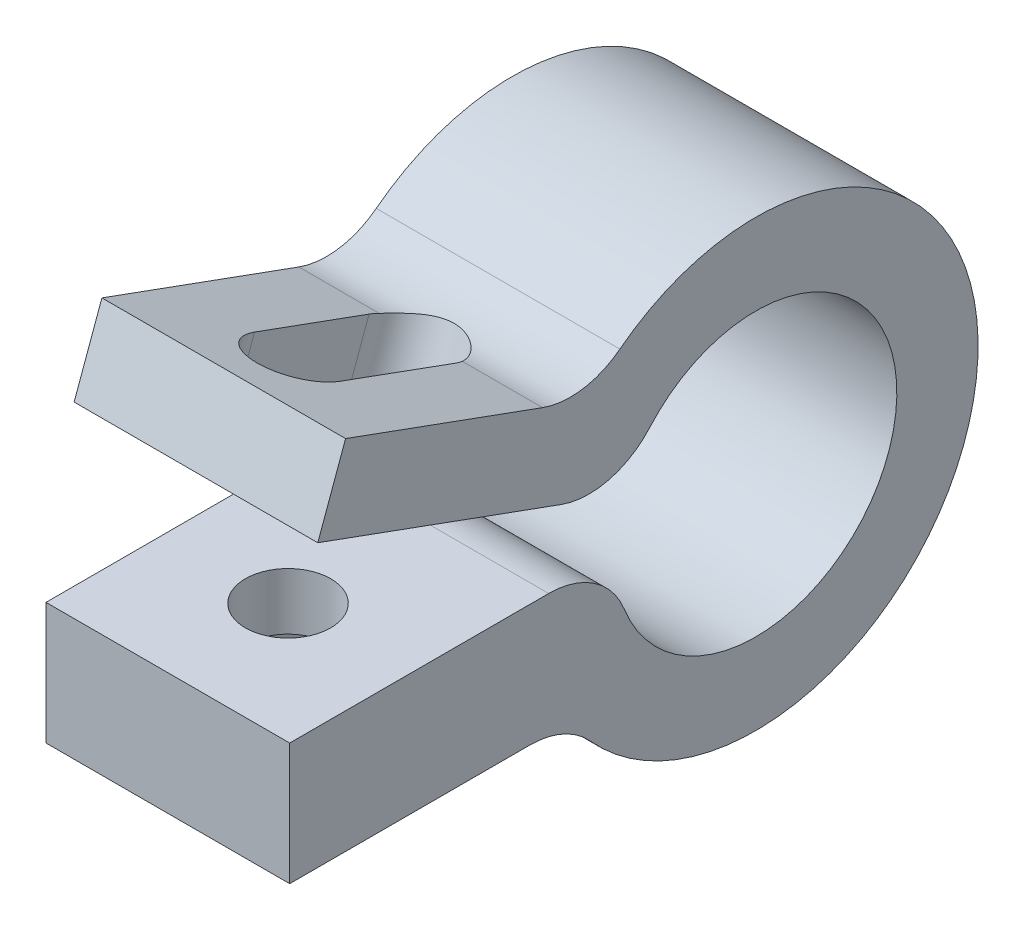
ISO-10303-21;
HEADER;
FILE_DESCRIPTION(('STEP AP214'),'2;1');
FILE_NAME('part.step','',(''),(''),'','','');
FILE_SCHEMA(('AUTOMOTIVE_DESIGN { 1 0 10303 214 1 1 1 1 }'));
ENDSEC;
DATA;
#1=APPLICATION_CONTEXT('core data for automotive mechanical design processes');
#2=APPLICATION_PROTOCOL_DEFINITION('international standard','automotive_design',2000,#1);
#3=PRODUCT_CONTEXT('',#1,'mechanical');
#4=PRODUCT('Part','Part','',(#3));
#5=PRODUCT_RELATED_PRODUCT_CATEGORY('part','',(#4));
#6=PRODUCT_DEFINITION_FORMATION('','',#4);
#7=PRODUCT_DEFINITION_CONTEXT('part definition',#1,'design');
#8=PRODUCT_DEFINITION('design','',#6,#7);
#9=PRODUCT_DEFINITION_SHAPE('','',#8);
#10=(LENGTH_UNIT() NAMED_UNIT(*) SI_UNIT(.MILLI.,.METRE.));
#11=(NAMED_UNIT(*) PLANE_ANGLE_UNIT() SI_UNIT($,.RADIAN.));
#12=(NAMED_UNIT(*) SI_UNIT($,.STERADIAN.) SOLID_ANGLE_UNIT());
#13=UNCERTAINTY_MEASURE_WITH_UNIT(LENGTH_MEASURE(1.E-05),#10,'distance_accuracy_value','');
#14=(GEOMETRIC_REPRESENTATION_CONTEXT(3) GLOBAL_UNCERTAINTY_ASSIGNED_CONTEXT((#13)) GLOBAL_UNIT_ASSIGNED_CONTEXT((#10,
#11,#12)) REPRESENTATION_CONTEXT('',''));
#15=CARTESIAN_POINT('',(0.,0.,0.));
#16=DIRECTION('',(0.,0.,1.));
#17=DIRECTION('',(1.,0.,0.));
#18=AXIS2_PLACEMENT_3D('',#15,#16,#17);
#19=CARTESIAN_POINT('',(6.,5.91853019811814,4.56581047503765));
#20=DIRECTION('',(-1.,0.,0.));
#21=DIRECTION('',(0.,0.,1.));
#22=AXIS2_PLACEMENT_3D('',#19,#20,#21);
#23=CYLINDRICAL_SURFACE('',#22,2.);
#24=CARTESIAN_POINT('',(4.02328075568502,4.03914495654632,5.24985076168898));
#25=CARTESIAN_POINT('',(4.01693659567688,4.02970640876131,5.22392671768483));
#26=CARTESIAN_POINT('',(4.00947704172476,4.02090379476189,5.19806314313565));
#27=CARTESIAN_POINT('',(3.99239936936169,4.00454872920655,5.14667174657911));
#28=CARTESIAN_POINT('',(3.98278243428403,3.99699559623572,5.12114374860172));
#29=CARTESIAN_POINT('',(3.95090081664605,3.97623467445256,5.04560145776037));
#30=CARTESIAN_POINT('',(3.92553880432151,3.96482924824209,4.99635912912839));
#31=CARTESIAN_POINT('',(3.8674641482402,3.94635006833639,4.90171972922054));
#32=CARTESIAN_POINT('',(3.83476389760315,3.93926908551365,4.85631635051501));
#33=CARTESIAN_POINT('',(3.76282939996074,3.9285595645157,4.77048068709393));
#34=CARTESIAN_POINT('',(3.72358729925232,3.92493521171681,4.73005448029087));
#35=CARTESIAN_POINT('',(3.63691402422221,3.92004334134182,4.65313738749375));
#36=CARTESIAN_POINT('',(3.58913121670079,3.91893154042587,4.61703212303424));
#37=CARTESIAN_POINT('',(3.48828882360345,3.91831438457499,4.55311418065907));
#38=CARTESIAN_POINT('',(3.43522959343984,3.91880892151038,4.52530094470803));
#39=CARTESIAN_POINT('',(3.32439795432762,3.92027956767505,4.47895899681839));
#40=CARTESIAN_POINT('',(3.26657536131501,3.9212615584193,4.46054939327361));
#41=CARTESIAN_POINT('',(3.14853981230169,3.92279061232673,4.43467083473479));
#42=CARTESIAN_POINT('',(3.08832878843552,3.92333801980751,4.42719321443808));
#43=CARTESIAN_POINT('',(2.97239510333669,3.92357725864138,4.4238167764806));
#44=CARTESIAN_POINT('',(2.91669655774002,3.92333370769233,4.42704390482159));
#45=CARTESIAN_POINT('',(2.80668177482694,3.92228995073745,4.44298047083795));
#46=CARTESIAN_POINT('',(2.75236570335653,3.92148967826875,4.45569104068445));
#47=CARTESIAN_POINT('',(2.64749279538036,3.91991298592941,4.4895981827193));
#48=CARTESIAN_POINT('',(2.59688795598907,3.91913639149086,4.51064778058917));
#49=CARTESIAN_POINT('',(2.49953091048112,3.91838414100569,4.56030293243714));
#50=CARTESIAN_POINT('',(2.45277984391418,3.91840872101843,4.58891071090721));
#51=CARTESIAN_POINT('',(2.3605118918484,3.92023325937804,4.65521019332456));
#52=CARTESIAN_POINT('',(2.31538453571052,3.92217337173441,4.69344112153393));
#53=CARTESIAN_POINT('',(2.23163805036825,3.92920209177196,4.77628575772425));
#54=CARTESIAN_POINT('',(2.19302385397557,3.93429307229314,4.82090425654101));
#55=CARTESIAN_POINT('',(2.12222450093141,3.94892622196349,4.91663994059504));
#56=CARTESIAN_POINT('',(2.090287509493,3.95860695541151,4.96792057306711));
#57=CARTESIAN_POINT('',(2.03568354662144,3.98338210061301,5.07387586249259));
#58=CARTESIAN_POINT('',(2.01298965015112,3.9984605442611,5.12854011923511));
#59=CARTESIAN_POINT('',(1.98832564335841,4.02352983834558,5.20575072036161));
#60=CARTESIAN_POINT('',(1.98211042650697,4.03110657602283,5.22778962504117));
#61=CARTESIAN_POINT('',(1.97671924431497,4.03914495654632,5.24985076168898));
#62=B_SPLINE_CURVE_WITH_KNOTS('',3,(#24,#25,#26,#27,#28,#29,#30,#31,#32,#33,#34,#35,#36,#37,#38,
#39,#40,#41,#42,#43,#44,#45,#46,#47,#48,#49,#50,#51,#52,#53,#54,#55,#56,#57,#58,#59,#60,#61),
.UNSPECIFIED.,.F.,.F.,(4,2,2,2,2,2,2,2,2,2,2,2,2,2,2,2,2,2,4),(0.,0.0848652684053053,
0.169684101151295,0.338452108342028,0.50693720996127,0.675626059629812,0.854512262027348,
1.03338642305597,1.21447331012985,1.39541657961535,1.56196093275596,1.72852517180851,
1.89227577154278,2.05607461945785,2.23281843301014,2.40969551013387,2.59229010533237,
2.77434893334036,2.84663638555457),.UNSPECIFIED.);
#63=CARTESIAN_POINT('',(4.02328075568502,4.03914495654632,5.24985076168898));
#64=VERTEX_POINT('',#63);
#65=CARTESIAN_POINT('',(1.97671924431497,4.03914495654632,5.24985076168898));
#66=VERTEX_POINT('',#65);
#67=EDGE_CURVE('E281',#64,#66,#62,.T.);
#68=ORIENTED_EDGE('',*,*,#67,.F.);
#69=DIRECTION('',(-1.,0.,0.));
#70=VECTOR('',#69,1.);
#71=CARTESIAN_POINT('',(6.,4.03914495654632,5.24985076168898));
#72=LINE('',#71,#70);
#73=CARTESIAN_POINT('',(6.,4.03914495654632,5.24985076168898));
#74=VERTEX_POINT('',#73);
#75=EDGE_CURVE('E348',#74,#64,#72,.T.);
#76=ORIENTED_EDGE('',*,*,#75,.F.);
#77=CARTESIAN_POINT('',(6.,5.91853019811814,4.56581047503765));
#78=DIRECTION('',(-1.,0.,0.));
#79=DIRECTION('',(0.,0.,1.));
#80=AXIS2_PLACEMENT_3D('',#77,#78,#79);
#81=CIRCLE('',#80,2.);
#82=CARTESIAN_POINT('',(6.,4.33497696785242,3.344188943255));
#83=VERTEX_POINT('',#82);
#84=EDGE_CURVE('E430',#83,#74,#81,.T.);
#85=ORIENTED_EDGE('',*,*,#84,.F.);
#86=DIRECTION('',(-1.,0.,0.));
#87=VECTOR('',#86,1.);
#88=CARTESIAN_POINT('',(6.,4.33497696785242,3.344188943255));
#89=LINE('',#88,#87);
#90=CARTESIAN_POINT('',(0.,4.33497696785242,3.344188943255));
#91=VERTEX_POINT('',#90);
#92=EDGE_CURVE('E406',#83,#91,#89,.T.);
#93=ORIENTED_EDGE('',*,*,#92,.T.);
#94=CARTESIAN_POINT('',(0.,5.91853019811814,4.56581047503765));
#95=DIRECTION('',(-1.,0.,0.));
#96=DIRECTION('',(0.,0.,1.));
#97=AXIS2_PLACEMENT_3D('',#94,#95,#96);
#98=CIRCLE('',#97,2.);
#99=CARTESIAN_POINT('',(0.,4.03914495654632,5.24985076168898));
#100=VERTEX_POINT('',#99);
#101=EDGE_CURVE('E366',#91,#100,#98,.T.);
#102=ORIENTED_EDGE('',*,*,#101,.T.);
#103=EDGE_CURVE('E404',#66,#100,#72,.T.);
#104=ORIENTED_EDGE('',*,*,#103,.F.);
#105=EDGE_LOOP('',(#68,#76,#85,#93,#102,#104));
#106=FACE_BOUND('',#105,.T.);
#107=ADVANCED_FACE('F41',(#106),#23,.F.);
#108=CARTESIAN_POINT('',(6.,4.03914495654632,5.24985076168898));
#109=DIRECTION('',(0.,-0.939692620785909,0.342020143325667));
#110=DIRECTION('',(0.,-0.342020143325667,-0.939692620785909));
#111=AXIS2_PLACEMENT_3D('',#108,#109,#110);
#112=PLANE('',#111);
#113=CARTESIAN_POINT('',(3.,4.11964439085314,5.47102113972583));
#114=DIRECTION('',(0.,-0.939692620785909,0.342020143325667));
#115=DIRECTION('',(0.,-0.342020143325667,-0.939692620785909));
#116=AXIS2_PLACEMENT_3D('',#113,#114,#115);
#117=CIRCLE('',#116,1.05);
#118=CARTESIAN_POINT('',(4.05,4.11964439085314,5.47102113972583));
#119=VERTEX_POINT('',#118);
#120=EDGE_CURVE('E282',#119,#64,#117,.F.);
#121=ORIENTED_EDGE('',*,*,#120,.F.);
#122=DIRECTION('',(0.,-0.342020143325667,-0.939692620785909));
#123=VECTOR('',#122,1.);
#124=CARTESIAN_POINT('',(4.05,4.03914495654632,5.24985076168898));
#125=LINE('',#124,#123);
#126=CARTESIAN_POINT('',(4.05,5.14570482083014,8.29009900208356));
#127=VERTEX_POINT('',#126);
#128=EDGE_CURVE('E273',#127,#119,#125,.T.);
#129=ORIENTED_EDGE('',*,*,#128,.F.);
#130=CARTESIAN_POINT('',(3.,5.14570482083014,8.29009900208356));
#131=DIRECTION('',(0.,-0.939692620785909,0.342020143325667));
#132=DIRECTION('',(0.,-0.342020143325667,-0.939692620785909));
#133=AXIS2_PLACEMENT_3D('',#130,#131,#132);
#134=CIRCLE('',#133,1.05);
#135=CARTESIAN_POINT('',(1.95,5.14570482083014,8.29009900208356));
#136=VERTEX_POINT('',#135);
#137=EDGE_CURVE('E275',#136,#127,#134,.F.);
#138=ORIENTED_EDGE('',*,*,#137,.F.);
#139=DIRECTION('',(0.,0.342020143325667,0.939692620785909));
#140=VECTOR('',#139,1.);
#141=CARTESIAN_POINT('',(1.95,4.03914495654632,5.24985076168898));
#142=LINE('',#141,#140);
#143=CARTESIAN_POINT('',(1.95,4.11964439085314,5.47102113972583));
#144=VERTEX_POINT('',#143);
#145=EDGE_CURVE('E277',#144,#136,#142,.T.);
#146=ORIENTED_EDGE('',*,*,#145,.F.);
#147=EDGE_CURVE('E279',#66,#144,#117,.F.);
#148=ORIENTED_EDGE('',*,*,#147,.F.);
#149=ORIENTED_EDGE('',*,*,#103,.T.);
#150=DIRECTION('',(0.,0.342020143325667,0.939692620785909));
#151=VECTOR('',#150,1.);
#152=CARTESIAN_POINT('',(0.,4.03914495654632,5.24985076168898));
#153=LINE('',#152,#151);
#154=CARTESIAN_POINT('',(0.,5.80406638623382,10.098932536867));
#155=VERTEX_POINT('',#154);
#156=EDGE_CURVE('E369',#100,#155,#153,.T.);
#157=ORIENTED_EDGE('',*,*,#156,.T.);
#158=DIRECTION('',(-1.,0.,0.));
#159=VECTOR('',#158,1.);
#160=CARTESIAN_POINT('',(6.,5.80406638623382,10.098932536867));
#161=LINE('',#160,#159);
#162=CARTESIAN_POINT('',(6.,5.80406638623382,10.098932536867));
#163=VERTEX_POINT('',#162);
#164=EDGE_CURVE('E401',#163,#155,#161,.T.);
#165=ORIENTED_EDGE('',*,*,#164,.F.);
#166=DIRECTION('',(0.,0.342020143325667,0.939692620785909));
#167=VECTOR('',#166,1.);
#168=CARTESIAN_POINT('',(6.,4.03914495654632,5.24985076168898));
#169=LINE('',#168,#167);
#170=EDGE_CURVE('E431',#74,#163,#169,.T.);
#171=ORIENTED_EDGE('',*,*,#170,.F.);
#172=ORIENTED_EDGE('',*,*,#75,.T.);
#173=EDGE_LOOP('',(#121,#129,#138,#146,#148,#149,#157,#165,#171,#172));
#174=FACE_BOUND('',#173,.T.);
#175=ADVANCED_FACE('F331',(#174),#112,.F.);
#176=CARTESIAN_POINT('',(6.,1.7431497084599,4.78926446272245));
#177=DIRECTION('',(0.,0.939692620785912,-0.342020143325659));
#178=DIRECTION('',(0.,0.342020143325659,0.939692620785912));
#179=AXIS2_PLACEMENT_3D('',#176,#177,#178);
#180=PLANE('',#179);
#181=DIRECTION('',(0.,-0.342020143325658,-0.939692620785912));
#182=VECTOR('',#181,1.);
#183=CARTESIAN_POINT('',(0.,1.7431497084599,4.78926446272245));
#184=LINE('',#183,#182);
#185=CARTESIAN_POINT('',(0.,3.92468114466199,10.7829728235183));
#186=VERTEX_POINT('',#185);
#187=CARTESIAN_POINT('',(0.,1.7431497084599,4.78926446272245));
#188=VERTEX_POINT('',#187);
#189=EDGE_CURVE('E373',#186,#188,#184,.T.);
#190=ORIENTED_EDGE('',*,*,#189,.T.);
#191=DIRECTION('',(-1.,0.,0.));
#192=VECTOR('',#191,1.);
#193=CARTESIAN_POINT('',(6.,1.7431497084599,4.78926446272245));
#194=LINE('',#193,#192);
#195=CARTESIAN_POINT('',(6.,1.7431497084599,4.78926446272245));
#196=VERTEX_POINT('',#195);
#197=EDGE_CURVE('E395',#196,#188,#194,.T.);
#198=ORIENTED_EDGE('',*,*,#197,.F.);
#199=DIRECTION('',(0.,-0.342020143325658,-0.939692620785912));
#200=VECTOR('',#199,1.);
#201=CARTESIAN_POINT('',(6.,1.7431497084599,4.78926446272245));
#202=LINE('',#201,#200);
#203=CARTESIAN_POINT('',(6.,3.92468114466199,10.7829728235183));
#204=VERTEX_POINT('',#203);
#205=EDGE_CURVE('E440',#204,#196,#202,.T.);
#206=ORIENTED_EDGE('',*,*,#205,.F.);
#207=DIRECTION('',(-1.,0.,0.));
#208=VECTOR('',#207,1.);
#209=CARTESIAN_POINT('',(6.,3.92468114466199,10.7829728235183));
#210=LINE('',#209,#208);
#211=EDGE_CURVE('E398',#204,#186,#210,.T.);
#212=ORIENTED_EDGE('',*,*,#211,.T.);
#213=EDGE_LOOP('',(#190,#198,#206,#212));
#214=FACE_BOUND('',#213,.T.);
#215=CARTESIAN_POINT('',(3.,2.24025914928132,6.15506142637716));
#216=DIRECTION('',(0.,0.939692620785909,-0.342020143325667));
#217=DIRECTION('',(0.,0.342020143325667,0.939692620785909));
#218=AXIS2_PLACEMENT_3D('',#215,#216,#217);
#219=CIRCLE('',#218,1.05);
#220=CARTESIAN_POINT('',(4.05,2.24025914928132,6.15506142637707));
#221=VERTEX_POINT('',#220);
#222=CARTESIAN_POINT('',(1.95,2.24025914928132,6.15506142637716));
#223=VERTEX_POINT('',#222);
#224=EDGE_CURVE('E246',#221,#223,#219,.T.);
#225=ORIENTED_EDGE('',*,*,#224,.T.);
#226=DIRECTION('',(0.,0.342020143325667,0.939692620785909));
#227=VECTOR('',#226,1.);
#228=CARTESIAN_POINT('',(1.95,2.24025914928132,6.15506142637716));
#229=LINE('',#228,#227);
#230=CARTESIAN_POINT('',(1.95,3.26631957925833,8.97413928873489));
#231=VERTEX_POINT('',#230);
#232=EDGE_CURVE('E256',#223,#231,#229,.T.);
#233=ORIENTED_EDGE('',*,*,#232,.T.);
#234=CARTESIAN_POINT('',(3.,3.26631957925833,8.97413928873489));
#235=DIRECTION('',(0.,0.939692620785909,-0.342020143325667));
#236=DIRECTION('',(0.,0.342020143325667,0.939692620785909));
#237=AXIS2_PLACEMENT_3D('',#234,#235,#236);
#238=CIRCLE('',#237,1.05);
#239=CARTESIAN_POINT('',(4.05,3.26631957925833,8.97413928873489));
#240=VERTEX_POINT('',#239);
#241=EDGE_CURVE('E259',#231,#240,#238,.T.);
#242=ORIENTED_EDGE('',*,*,#241,.T.);
#243=DIRECTION('',(0.,-0.342020143325667,-0.939692620785909));
#244=VECTOR('',#243,1.);
#245=CARTESIAN_POINT('',(4.05,2.24025914928132,6.15506142637716));
#246=LINE('',#245,#244);
#247=EDGE_CURVE('E262',#240,#221,#246,.T.);
#248=ORIENTED_EDGE('',*,*,#247,.T.);
#249=EDGE_LOOP('',(#225,#233,#242,#248));
#250=FACE_BOUND('',#249,.T.);
#251=ADVANCED_FACE('F328',(#214,#250),#180,.F.);
#252=CARTESIAN_POINT('',(6.,-2.,11.475));
#253=DIRECTION('',(0.,0.,-1.));
#254=DIRECTION('',(0.,1.,0.));
#255=AXIS2_PLACEMENT_3D('',#252,#253,#254);
#256=PLANE('',#255);
#257=DIRECTION('',(0.,-1.,0.));
#258=VECTOR('',#257,1.);
#259=CARTESIAN_POINT('',(0.,-2.,11.475));
#260=LINE('',#259,#258);
#261=CARTESIAN_POINT('',(0.,0.,11.475));
#262=VERTEX_POINT('',#261);
#263=CARTESIAN_POINT('',(0.,-3.,11.475));
#264=VERTEX_POINT('',#263);
#265=EDGE_CURVE('E351',#262,#264,#260,.T.);
#266=ORIENTED_EDGE('',*,*,#265,.T.);
#267=DIRECTION('',(-1.,0.,0.));
#268=VECTOR('',#267,1.);
#269=CARTESIAN_POINT('',(6.,-3.,11.475));
#270=LINE('',#269,#268);
#271=CARTESIAN_POINT('',(6.,-3.,11.475));
#272=VERTEX_POINT('',#271);
#273=EDGE_CURVE('E11',#272,#264,#270,.T.);
#274=ORIENTED_EDGE('',*,*,#273,.F.);
#275=DIRECTION('',(0.,-1.,0.));
#276=VECTOR('',#275,1.);
#277=CARTESIAN_POINT('',(6.,0.,11.475));
#278=LINE('',#277,#276);
#279=CARTESIAN_POINT('',(6.,0.,11.475));
#280=VERTEX_POINT('',#279);
#281=EDGE_CURVE('E290',#280,#272,#278,.T.);
#282=ORIENTED_EDGE('',*,*,#281,.F.);
#283=DIRECTION('',(-1.,0.,0.));
#284=VECTOR('',#283,1.);
#285=CARTESIAN_POINT('',(6.,0.,11.475));
#286=LINE('',#285,#284);
#287=EDGE_CURVE('E384',#280,#262,#286,.T.);
#288=ORIENTED_EDGE('',*,*,#287,.T.);
#289=EDGE_LOOP('',(#266,#274,#282,#288));
#290=FACE_BOUND('',#289,.T.);
#291=ADVANCED_FACE('F43',(#290),#256,.F.);
#292=CARTESIAN_POINT('',(6.,-3.,11.475));
#293=DIRECTION('',(0.,1.,0.));
#294=DIRECTION('',(0.,0.,1.));
#295=AXIS2_PLACEMENT_3D('',#292,#293,#294);
#296=PLANE('',#295);
#297=DIRECTION('',(-1.,0.,0.));
#298=VECTOR('',#297,1.);
#299=CARTESIAN_POINT('',(4.15470053837924,-3.,10.5157919662987));
#300=LINE('',#299,#298);
#301=CARTESIAN_POINT('',(4.15470053837924,-3.,10.5157919662987));
#302=VERTEX_POINT('',#301);
#303=CARTESIAN_POINT('',(1.84529946162075,-3.,10.5157919662987));
#304=VERTEX_POINT('',#303);
#305=EDGE_CURVE('E234',#302,#304,#300,.T.);
#306=ORIENTED_EDGE('',*,*,#305,.F.);
#307=DIRECTION('',(-0.5,0.,0.866025403784439));
#308=VECTOR('',#307,1.);
#309=CARTESIAN_POINT('',(5.30940107675849,-3.,8.51579196629872));
#310=LINE('',#309,#308);
#311=CARTESIAN_POINT('',(5.30940107675849,-3.,8.51579196629872));
#312=VERTEX_POINT('',#311);
#313=EDGE_CURVE('E56',#312,#302,#310,.T.);
#314=ORIENTED_EDGE('',*,*,#313,.F.);
#315=DIRECTION('',(0.5,0.,0.866025403784439));
#316=VECTOR('',#315,1.);
#317=CARTESIAN_POINT('',(4.15470053837924,-3.,6.51579196629873));
#318=LINE('',#317,#316);
#319=CARTESIAN_POINT('',(4.15470053837924,-3.,6.51579196629873));
#320=VERTEX_POINT('',#319);
#321=EDGE_CURVE('E217',#320,#312,#318,.T.);
#322=ORIENTED_EDGE('',*,*,#321,.F.);
#323=DIRECTION('',(1.,0.,0.));
#324=VECTOR('',#323,1.);
#325=CARTESIAN_POINT('',(1.84529946162075,-3.,6.51579196629873));
#326=LINE('',#325,#324);
#327=CARTESIAN_POINT('',(1.84529946162075,-3.,6.51579196629873));
#328=VERTEX_POINT('',#327);
#329=EDGE_CURVE('E220',#328,#320,#326,.T.);
#330=ORIENTED_EDGE('',*,*,#329,.F.);
#331=DIRECTION('',(0.5,0.,-0.866025403784439));
#332=VECTOR('',#331,1.);
#333=CARTESIAN_POINT('',(0.69059892324151,-3.,8.51579196629872));
#334=LINE('',#333,#332);
#335=CARTESIAN_POINT('',(0.69059892324151,-3.,8.51579196629872));
#336=VERTEX_POINT('',#335);
#337=EDGE_CURVE('E239',#336,#328,#334,.T.);
#338=ORIENTED_EDGE('',*,*,#337,.F.);
#339=DIRECTION('',(-0.5,0.,-0.866025403784438));
#340=VECTOR('',#339,1.);
#341=CARTESIAN_POINT('',(1.84529946162075,-3.,10.5157919662987));
#342=LINE('',#341,#340);
#343=EDGE_CURVE('E236',#304,#336,#342,.T.);
#344=ORIENTED_EDGE('',*,*,#343,.F.);
#345=EDGE_LOOP('',(#306,#314,#322,#330,#338,#344));
#346=FACE_BOUND('',#345,.T.);
#347=DIRECTION('',(0.,0.,-1.));
#348=VECTOR('',#347,1.);
#349=CARTESIAN_POINT('',(0.,-3.,11.475));
#350=LINE('',#349,#348);
#351=CARTESIAN_POINT('',(0.,-3.,5.55658393259745));
#352=VERTEX_POINT('',#351);
#353=EDGE_CURVE('E352',#264,#352,#350,.T.);
#354=ORIENTED_EDGE('',*,*,#353,.T.);
#355=DIRECTION('',(-1.,0.,0.));
#356=VECTOR('',#355,1.);
#357=CARTESIAN_POINT('',(6.,-3.,5.55658393259745));
#358=LINE('',#357,#356);
#359=CARTESIAN_POINT('',(6.,-3.,5.55658393259745));
#360=VERTEX_POINT('',#359);
#361=EDGE_CURVE('E49',#360,#352,#358,.T.);
#362=ORIENTED_EDGE('',*,*,#361,.F.);
#363=DIRECTION('',(0.,0.,-1.));
#364=VECTOR('',#363,1.);
#365=CARTESIAN_POINT('',(6.,-3.,11.475));
#366=LINE('',#365,#364);
#367=EDGE_CURVE('E453',#272,#360,#366,.T.);
#368=ORIENTED_EDGE('',*,*,#367,.F.);
#369=ORIENTED_EDGE('',*,*,#273,.T.);
#370=EDGE_LOOP('',(#354,#362,#368,#369));
#371=FACE_BOUND('',#370,.T.);
#372=ADVANCED_FACE('F454',(#346,#371),#296,.F.);
#373=CARTESIAN_POINT('',(6.,-5.,5.55658393259745));
#374=DIRECTION('',(-1.,0.,0.));
#375=DIRECTION('',(0.,0.,1.));
#376=AXIS2_PLACEMENT_3D('',#373,#374,#375);
#377=CYLINDRICAL_SURFACE('',#376,2.);
#378=CARTESIAN_POINT('',(0.,-5.,5.55658393259745));
#379=DIRECTION('',(-1.,0.,0.));
#380=DIRECTION('',(0.,0.,1.));
#381=AXIS2_PLACEMENT_3D('',#378,#379,#380);
#382=CIRCLE('',#381,2.);
#383=CARTESIAN_POINT('',(0.,-3.66220735785953,4.06987251250448));
#384=VERTEX_POINT('',#383);
#385=EDGE_CURVE('E357',#352,#384,#382,.T.);
#386=ORIENTED_EDGE('',*,*,#385,.T.);
#387=DIRECTION('',(-1.,0.,0.));
#388=VECTOR('',#387,1.);
#389=CARTESIAN_POINT('',(6.,-3.66220735785953,4.06987251250448));
#390=LINE('',#389,#388);
#391=CARTESIAN_POINT('',(6.,-3.66220735785953,4.06987251250448));
#392=VERTEX_POINT('',#391);
#393=EDGE_CURVE('E409',#392,#384,#390,.T.);
#394=ORIENTED_EDGE('',*,*,#393,.F.);
#395=CARTESIAN_POINT('',(6.,-5.,5.55658393259745));
#396=DIRECTION('',(-1.,0.,0.));
#397=DIRECTION('',(0.,0.,1.));
#398=AXIS2_PLACEMENT_3D('',#395,#396,#397);
#399=CIRCLE('',#398,2.);
#400=EDGE_CURVE('E418',#360,#392,#399,.T.);
#401=ORIENTED_EDGE('',*,*,#400,.F.);
#402=ORIENTED_EDGE('',*,*,#361,.T.);
#403=EDGE_LOOP('',(#386,#394,#401,#402));
#404=FACE_BOUND('',#403,.T.);
#405=ADVANCED_FACE('F416',(#404),#377,.F.);
#406=CARTESIAN_POINT('',(6.,0.,0.));
#407=DIRECTION('',(-1.,0.,0.));
#408=DIRECTION('',(0.,0.,1.));
#409=AXIS2_PLACEMENT_3D('',#406,#407,#408);
#410=CYLINDRICAL_SURFACE('',#409,5.475);
#411=CARTESIAN_POINT('',(0.,0.,0.));
#412=DIRECTION('',(1.,0.,0.));
#413=DIRECTION('',(0.,0.,-1.));
#414=AXIS2_PLACEMENT_3D('',#411,#412,#413);
#415=CIRCLE('',#414,5.475);
#416=EDGE_CURVE('E364',#384,#91,#415,.T.);
#417=ORIENTED_EDGE('',*,*,#416,.T.);
#418=ORIENTED_EDGE('',*,*,#92,.F.);
#419=CARTESIAN_POINT('',(6.,0.,0.));
#420=DIRECTION('',(1.,0.,0.));
#421=DIRECTION('',(0.,0.,-1.));
#422=AXIS2_PLACEMENT_3D('',#419,#420,#421);
#423=CIRCLE('',#422,5.475);
#424=EDGE_CURVE('E432',#392,#83,#423,.T.);
#425=ORIENTED_EDGE('',*,*,#424,.F.);
#426=ORIENTED_EDGE('',*,*,#393,.T.);
#427=EDGE_LOOP('',(#417,#418,#425,#426));
#428=FACE_BOUND('',#427,.T.);
#429=ADVANCED_FACE('F334',(#428),#410,.T.);
#430=CARTESIAN_POINT('',(6.,3.92468114466199,10.7829728235183));
#431=DIRECTION('',(0.,-0.342020143325661,-0.939692620785911));
#432=DIRECTION('',(0.,0.939692620785911,-0.342020143325661));
#433=AXIS2_PLACEMENT_3D('',#430,#431,#432);
#434=PLANE('',#433);
#435=DIRECTION('',(0.,-0.939692620785911,0.342020143325661));
#436=VECTOR('',#435,1.);
#437=CARTESIAN_POINT('',(0.,3.92468114466199,10.7829728235183));
#438=LINE('',#437,#436);
#439=EDGE_CURVE('E371',#155,#186,#438,.T.);
#440=ORIENTED_EDGE('',*,*,#439,.T.);
#441=ORIENTED_EDGE('',*,*,#211,.F.);
#442=DIRECTION('',(0.,-0.939692620785911,0.342020143325661));
#443=VECTOR('',#442,1.);
#444=CARTESIAN_POINT('',(6.,3.92468114466199,10.7829728235183));
#445=LINE('',#444,#443);
#446=EDGE_CURVE('E434',#163,#204,#445,.T.);
#447=ORIENTED_EDGE('',*,*,#446,.F.);
#448=ORIENTED_EDGE('',*,*,#164,.T.);
#449=EDGE_LOOP('',(#440,#441,#447,#448));
#450=FACE_BOUND('',#449,.T.);
#451=ADVANCED_FACE('F326',(#450),#434,.F.);
#452=CARTESIAN_POINT('',(6.,3.62253495003173,4.10522417607112));
#453=DIRECTION('',(-1.,0.,0.));
#454=DIRECTION('',(0.,0.,1.));
#455=AXIS2_PLACEMENT_3D('',#452,#453,#454);
#456=CYLINDRICAL_SURFACE('',#455,2.00000000000001);
#457=CARTESIAN_POINT('',(0.,3.62253495003173,4.10522417607112));
#458=DIRECTION('',(1.,0.,0.));
#459=DIRECTION('',(0.,0.,1.));
#460=AXIS2_PLACEMENT_3D('',#457,#458,#459);
#461=CIRCLE('',#460,2.00000000000001);
#462=CARTESIAN_POINT('',(0.,2.29923451166397,2.60559890627345));
#463=VERTEX_POINT('',#462);
#464=EDGE_CURVE('E375',#188,#463,#461,.T.);
#465=ORIENTED_EDGE('',*,*,#464,.T.);
#466=DIRECTION('',(-1.,0.,0.));
#467=VECTOR('',#466,1.);
#468=CARTESIAN_POINT('',(6.,2.29923451166397,2.60559890627345));
#469=LINE('',#468,#467);
#470=CARTESIAN_POINT('',(6.,2.29923451166397,2.60559890627345));
#471=VERTEX_POINT('',#470);
#472=EDGE_CURVE('E392',#471,#463,#469,.T.);
#473=ORIENTED_EDGE('',*,*,#472,.F.);
#474=CARTESIAN_POINT('',(6.,3.62253495003173,4.10522417607112));
#475=DIRECTION('',(1.,0.,0.));
#476=DIRECTION('',(0.,0.,1.));
#477=AXIS2_PLACEMENT_3D('',#474,#475,#476);
#478=CIRCLE('',#477,2.00000000000001);
#479=EDGE_CURVE('E442',#196,#471,#478,.T.);
#480=ORIENTED_EDGE('',*,*,#479,.F.);
#481=ORIENTED_EDGE('',*,*,#197,.T.);
#482=EDGE_LOOP('',(#465,#473,#480,#481));
#483=FACE_BOUND('',#482,.T.);
#484=ADVANCED_FACE('F322',(#483),#456,.T.);
#485=CARTESIAN_POINT('',(6.,0.,0.));
#486=DIRECTION('',(-1.,0.,0.));
#487=DIRECTION('',(0.,0.,1.));
#488=AXIS2_PLACEMENT_3D('',#485,#486,#487);
#489=CYLINDRICAL_SURFACE('',#488,3.47500000000001);
#490=CARTESIAN_POINT('',(0.,0.,0.));
#491=DIRECTION('',(-1.,0.,0.));
#492=DIRECTION('',(0.,0.,-1.));
#493=AXIS2_PLACEMENT_3D('',#490,#491,#492);
#494=CIRCLE('',#493,3.47500000000001);
#495=CARTESIAN_POINT('',(0.,-1.26940639269407,3.23484658217163));
#496=VERTEX_POINT('',#495);
#497=EDGE_CURVE('E377',#463,#496,#494,.T.);
#498=ORIENTED_EDGE('',*,*,#497,.T.);
#499=DIRECTION('',(-1.,0.,0.));
#500=VECTOR('',#499,1.);
#501=CARTESIAN_POINT('',(6.,-1.26940639269407,3.23484658217163));
#502=LINE('',#501,#500);
#503=CARTESIAN_POINT('',(6.,-1.26940639269407,3.23484658217163));
#504=VERTEX_POINT('',#503);
#505=EDGE_CURVE('E389',#504,#496,#502,.T.);
#506=ORIENTED_EDGE('',*,*,#505,.F.);
#507=CARTESIAN_POINT('',(6.,0.,0.));
#508=DIRECTION('',(-1.,0.,0.));
#509=DIRECTION('',(0.,0.,-1.));
#510=AXIS2_PLACEMENT_3D('',#507,#508,#509);
#511=CIRCLE('',#510,3.47500000000001);
#512=EDGE_CURVE('E444',#471,#504,#511,.T.);
#513=ORIENTED_EDGE('',*,*,#512,.F.);
#514=ORIENTED_EDGE('',*,*,#472,.T.);
#515=EDGE_LOOP('',(#498,#506,#513,#514));
#516=FACE_BOUND('',#515,.T.);
#517=ADVANCED_FACE('F318',(#516),#489,.F.);
#518=CARTESIAN_POINT('',(6.,-2.,5.09662878773803));
#519=DIRECTION('',(-1.,0.,0.));
#520=DIRECTION('',(0.,0.,1.));
#521=AXIS2_PLACEMENT_3D('',#518,#519,#520);
#522=CYLINDRICAL_SURFACE('',#521,2.);
#523=CARTESIAN_POINT('',(0.,-2.,5.09662878773803));
#524=DIRECTION('',(1.,0.,0.));
#525=DIRECTION('',(0.,0.,1.));
#526=AXIS2_PLACEMENT_3D('',#523,#524,#525);
#527=CIRCLE('',#526,2.);
#528=CARTESIAN_POINT('',(0.,0.,5.09662878773803));
#529=VERTEX_POINT('',#528);
#530=EDGE_CURVE('E379',#496,#529,#527,.T.);
#531=ORIENTED_EDGE('',*,*,#530,.T.);
#532=DIRECTION('',(-1.,0.,0.));
#533=VECTOR('',#532,1.);
#534=CARTESIAN_POINT('',(6.,0.,5.09662878773803));
#535=LINE('',#534,#533);
#536=CARTESIAN_POINT('',(6.,0.,5.09662878773803));
#537=VERTEX_POINT('',#536);
#538=EDGE_CURVE('E386',#537,#529,#535,.T.);
#539=ORIENTED_EDGE('',*,*,#538,.F.);
#540=CARTESIAN_POINT('',(6.,-2.,5.09662878773803));
#541=DIRECTION('',(1.,0.,0.));
#542=DIRECTION('',(0.,0.,1.));
#543=AXIS2_PLACEMENT_3D('',#540,#541,#542);
#544=CIRCLE('',#543,2.);
#545=EDGE_CURVE('E445',#504,#537,#544,.T.);
#546=ORIENTED_EDGE('',*,*,#545,.F.);
#547=ORIENTED_EDGE('',*,*,#505,.T.);
#548=EDGE_LOOP('',(#531,#539,#546,#547));
#549=FACE_BOUND('',#548,.T.);
#550=ADVANCED_FACE('F314',(#549),#522,.T.);
#551=CARTESIAN_POINT('',(6.,0.,11.475));
#552=DIRECTION('',(0.,-1.,0.));
#553=DIRECTION('',(0.,0.,-1.));
#554=AXIS2_PLACEMENT_3D('',#551,#552,#553);
#555=PLANE('',#554);
#556=CARTESIAN_POINT('',(3.,0.,8.51579196629872));
#557=DIRECTION('',(0.,-1.,0.));
#558=DIRECTION('',(0.,0.,-1.));
#559=AXIS2_PLACEMENT_3D('',#556,#557,#558);
#560=CIRCLE('',#559,1.05);
#561=CARTESIAN_POINT('',(3.,0.,7.46579196629872));
#562=VERTEX_POINT('',#561);
#563=EDGE_CURVE('E223',#562,#562,#560,.T.);
#564=ORIENTED_EDGE('',*,*,#563,.T.);
#565=EDGE_LOOP('',(#564));
#566=FACE_BOUND('',#565,.T.);
#567=DIRECTION('',(0.,0.,1.));
#568=VECTOR('',#567,1.);
#569=CARTESIAN_POINT('',(0.,0.,11.475));
#570=LINE('',#569,#568);
#571=EDGE_CURVE('E381',#529,#262,#570,.T.);
#572=ORIENTED_EDGE('',*,*,#571,.T.);
#573=ORIENTED_EDGE('',*,*,#287,.F.);
#574=DIRECTION('',(0.,0.,1.));
#575=VECTOR('',#574,1.);
#576=CARTESIAN_POINT('',(6.,0.,11.475));
#577=LINE('',#576,#575);
#578=EDGE_CURVE('E360',#537,#280,#577,.T.);
#579=ORIENTED_EDGE('',*,*,#578,.F.);
#580=ORIENTED_EDGE('',*,*,#538,.T.);
#581=EDGE_LOOP('',(#572,#573,#579,#580));
#582=FACE_BOUND('',#581,.T.);
#583=ADVANCED_FACE('F307',(#566,#582),#555,.F.);
#584=CARTESIAN_POINT('',(6.,-5.,5.55658393259745));
#585=DIRECTION('',(-1.,0.,0.));
#586=DIRECTION('',(0.,0.,1.));
#587=AXIS2_PLACEMENT_3D('',#584,#585,#586);
#588=PLANE('',#587);
#589=ORIENTED_EDGE('',*,*,#281,.T.);
#590=ORIENTED_EDGE('',*,*,#367,.T.);
#591=ORIENTED_EDGE('',*,*,#400,.T.);
#592=ORIENTED_EDGE('',*,*,#424,.T.);
#593=ORIENTED_EDGE('',*,*,#84,.T.);
#594=ORIENTED_EDGE('',*,*,#170,.T.);
#595=ORIENTED_EDGE('',*,*,#446,.T.);
#596=ORIENTED_EDGE('',*,*,#205,.T.);
#597=ORIENTED_EDGE('',*,*,#479,.T.);
#598=ORIENTED_EDGE('',*,*,#512,.T.);
#599=ORIENTED_EDGE('',*,*,#545,.T.);
#600=ORIENTED_EDGE('',*,*,#578,.T.);
#601=EDGE_LOOP('',(#589,#590,#591,#592,#593,#594,#595,#596,#597,#598,#599,#600));
#602=FACE_BOUND('',#601,.T.);
#603=ADVANCED_FACE('F304',(#602),#588,.F.);
#604=CARTESIAN_POINT('',(0.,-5.,5.55658393259745));
#605=DIRECTION('',(-1.,0.,0.));
#606=DIRECTION('',(0.,0.,1.));
#607=AXIS2_PLACEMENT_3D('',#604,#605,#606);
#608=PLANE('',#607);
#609=ORIENTED_EDGE('',*,*,#265,.F.);
#610=ORIENTED_EDGE('',*,*,#571,.F.);
#611=ORIENTED_EDGE('',*,*,#530,.F.);
#612=ORIENTED_EDGE('',*,*,#497,.F.);
#613=ORIENTED_EDGE('',*,*,#464,.F.);
#614=ORIENTED_EDGE('',*,*,#189,.F.);
#615=ORIENTED_EDGE('',*,*,#439,.F.);
#616=ORIENTED_EDGE('',*,*,#156,.F.);
#617=ORIENTED_EDGE('',*,*,#101,.F.);
#618=ORIENTED_EDGE('',*,*,#416,.F.);
#619=ORIENTED_EDGE('',*,*,#385,.F.);
#620=ORIENTED_EDGE('',*,*,#353,.F.);
#621=EDGE_LOOP('',(#609,#610,#611,#612,#613,#614,#615,#616,#617,#618,#619,#620));
#622=FACE_BOUND('',#621,.T.);
#623=ADVANCED_FACE('F301',(#622),#608,.T.);
#624=CARTESIAN_POINT('',(3.,13.5165705987122,2.05081970646916));
#625=DIRECTION('',(0.,-0.939692620785909,0.342020143325667));
#626=DIRECTION('',(0.,-0.342020143325667,-0.939692620785909));
#627=AXIS2_PLACEMENT_3D('',#624,#625,#626);
#628=CYLINDRICAL_SURFACE('',#627,1.05);
#629=ORIENTED_EDGE('',*,*,#120,.T.);
#630=ORIENTED_EDGE('',*,*,#67,.T.);
#631=ORIENTED_EDGE('',*,*,#147,.T.);
#632=DIRECTION('',(0.,-0.939692620785909,0.342020143325667));
#633=VECTOR('',#632,1.);
#634=CARTESIAN_POINT('',(1.95,13.5165705987122,2.05081970646916));
#635=LINE('',#634,#633);
#636=EDGE_CURVE('E271',#144,#223,#635,.T.);
#637=ORIENTED_EDGE('',*,*,#636,.T.);
#638=ORIENTED_EDGE('',*,*,#224,.F.);
#639=DIRECTION('',(0.,-0.939692620785909,0.342020143325667));
#640=VECTOR('',#639,1.);
#641=CARTESIAN_POINT('',(4.05,13.5165705987122,2.05081970646916));
#642=LINE('',#641,#640);
#643=EDGE_CURVE('E265',#119,#221,#642,.T.);
#644=ORIENTED_EDGE('',*,*,#643,.F.);
#645=EDGE_LOOP('',(#629,#630,#631,#637,#638,#644));
#646=FACE_BOUND('',#645,.T.);
#647=ADVANCED_FACE('F295',(#646),#628,.F.);
#648=CARTESIAN_POINT('',(1.95,13.5165705987122,2.05081970646916));
#649=DIRECTION('',(1.,0.,0.));
#650=DIRECTION('',(0.,0.,-1.));
#651=AXIS2_PLACEMENT_3D('',#648,#649,#650);
#652=PLANE('',#651);
#653=ORIENTED_EDGE('',*,*,#145,.T.);
#654=DIRECTION('',(0.,-0.939692620785909,0.342020143325667));
#655=VECTOR('',#654,1.);
#656=CARTESIAN_POINT('',(1.95,14.5426310286892,4.86989756882689));
#657=LINE('',#656,#655);
#658=EDGE_CURVE('E269',#136,#231,#657,.T.);
#659=ORIENTED_EDGE('',*,*,#658,.T.);
#660=ORIENTED_EDGE('',*,*,#232,.F.);
#661=ORIENTED_EDGE('',*,*,#636,.F.);
#662=EDGE_LOOP('',(#653,#659,#660,#661));
#663=FACE_BOUND('',#662,.T.);
#664=ADVANCED_FACE('F300',(#663),#652,.T.);
#665=CARTESIAN_POINT('',(3.,14.5426310286892,4.86989756882689));
#666=DIRECTION('',(0.,-0.939692620785909,0.342020143325667));
#667=DIRECTION('',(0.,-0.342020143325667,-0.939692620785909));
#668=AXIS2_PLACEMENT_3D('',#665,#666,#667);
#669=CYLINDRICAL_SURFACE('',#668,1.05);
#670=ORIENTED_EDGE('',*,*,#137,.T.);
#671=DIRECTION('',(0.,-0.939692620785909,0.342020143325667));
#672=VECTOR('',#671,1.);
#673=CARTESIAN_POINT('',(4.05,14.5426310286892,4.86989756882689));
#674=LINE('',#673,#672);
#675=EDGE_CURVE('E64',#127,#240,#674,.T.);
#676=ORIENTED_EDGE('',*,*,#675,.T.);
#677=ORIENTED_EDGE('',*,*,#241,.F.);
#678=ORIENTED_EDGE('',*,*,#658,.F.);
#679=EDGE_LOOP('',(#670,#676,#677,#678));
#680=FACE_BOUND('',#679,.T.);
#681=ADVANCED_FACE('F509',(#680),#669,.F.);
#682=CARTESIAN_POINT('',(4.05,13.5165705987122,2.05081970646916));
#683=DIRECTION('',(-1.,0.,0.));
#684=DIRECTION('',(0.,0.,1.));
#685=AXIS2_PLACEMENT_3D('',#682,#683,#684);
#686=PLANE('',#685);
#687=ORIENTED_EDGE('',*,*,#128,.T.);
#688=ORIENTED_EDGE('',*,*,#643,.T.);
#689=ORIENTED_EDGE('',*,*,#247,.F.);
#690=ORIENTED_EDGE('',*,*,#675,.F.);
#691=EDGE_LOOP('',(#687,#688,#689,#690));
#692=FACE_BOUND('',#691,.T.);
#693=ADVANCED_FACE('F516',(#692),#686,.T.);
#694=CARTESIAN_POINT('',(5.30940107675849,-1.4,8.51579196629872));
#695=DIRECTION('',(0.866025403784439,0.,0.5));
#696=DIRECTION('',(0.5,0.,-0.866025403784439));
#697=AXIS2_PLACEMENT_3D('',#694,#695,#696);
#698=PLANE('',#697);
#699=ORIENTED_EDGE('',*,*,#313,.T.);
#700=DIRECTION('',(0.,-1.,0.));
#701=VECTOR('',#700,1.);
#702=CARTESIAN_POINT('',(4.15470053837924,-1.4,10.5157919662987));
#703=LINE('',#702,#701);
#704=CARTESIAN_POINT('',(4.15470053837924,-1.4,10.5157919662987));
#705=VERTEX_POINT('',#704);
#706=EDGE_CURVE('E194',#705,#302,#703,.T.);
#707=ORIENTED_EDGE('',*,*,#706,.F.);
#708=DIRECTION('',(-0.5,0.,0.866025403784439));
#709=VECTOR('',#708,1.);
#710=CARTESIAN_POINT('',(5.30940107675849,-1.4,8.51579196629872));
#711=LINE('',#710,#709);
#712=CARTESIAN_POINT('',(5.30940107675849,-1.4,8.51579196629872));
#713=VERTEX_POINT('',#712);
#714=EDGE_CURVE('E198',#713,#705,#711,.T.);
#715=ORIENTED_EDGE('',*,*,#714,.F.);
#716=DIRECTION('',(0.,-1.,0.));
#717=VECTOR('',#716,1.);
#718=CARTESIAN_POINT('',(5.30940107675849,-1.4,8.51579196629872));
#719=LINE('',#718,#717);
#720=EDGE_CURVE('E244',#713,#312,#719,.T.);
#721=ORIENTED_EDGE('',*,*,#720,.T.);
#722=EDGE_LOOP('',(#699,#707,#715,#721));
#723=FACE_BOUND('',#722,.T.);
#724=ADVANCED_FACE('F196',(#723),#698,.F.);
#725=CARTESIAN_POINT('',(4.15470053837924,-1.4,6.51579196629873));
#726=DIRECTION('',(0.866025403784439,0.,-0.5));
#727=DIRECTION('',(-0.5,0.,-0.866025403784439));
#728=AXIS2_PLACEMENT_3D('',#725,#726,#727);
#729=PLANE('',#728);
#730=ORIENTED_EDGE('',*,*,#321,.T.);
#731=ORIENTED_EDGE('',*,*,#720,.F.);
#732=DIRECTION('',(0.5,0.,0.866025403784439));
#733=VECTOR('',#732,1.);
#734=CARTESIAN_POINT('',(4.15470053837924,-1.4,6.51579196629873));
#735=LINE('',#734,#733);
#736=CARTESIAN_POINT('',(4.15470053837924,-1.4,6.51579196629873));
#737=VERTEX_POINT('',#736);
#738=EDGE_CURVE('E204',#737,#713,#735,.T.);
#739=ORIENTED_EDGE('',*,*,#738,.F.);
#740=DIRECTION('',(0.,-1.,0.));
#741=VECTOR('',#740,1.);
#742=CARTESIAN_POINT('',(4.15470053837924,-1.4,6.51579196629873));
#743=LINE('',#742,#741);
#744=EDGE_CURVE('E247',#737,#320,#743,.T.);
#745=ORIENTED_EDGE('',*,*,#744,.T.);
#746=EDGE_LOOP('',(#730,#731,#739,#745));
#747=FACE_BOUND('',#746,.T.);
#748=ADVANCED_FACE('F529',(#747),#729,.F.);
#749=CARTESIAN_POINT('',(1.84529946162075,-1.4,6.51579196629873));
#750=DIRECTION('',(0.,0.,-1.));
#751=DIRECTION('',(-1.,0.,0.));
#752=AXIS2_PLACEMENT_3D('',#749,#750,#751);
#753=PLANE('',#752);
#754=ORIENTED_EDGE('',*,*,#329,.T.);
#755=ORIENTED_EDGE('',*,*,#744,.F.);
#756=DIRECTION('',(1.,0.,0.));
#757=VECTOR('',#756,1.);
#758=CARTESIAN_POINT('',(1.84529946162075,-1.4,6.51579196629873));
#759=LINE('',#758,#757);
#760=CARTESIAN_POINT('',(1.84529946162075,-1.4,6.51579196629873));
#761=VERTEX_POINT('',#760);
#762=EDGE_CURVE('E230',#761,#737,#759,.T.);
#763=ORIENTED_EDGE('',*,*,#762,.F.);
#764=DIRECTION('',(0.,-1.,0.));
#765=VECTOR('',#764,1.);
#766=CARTESIAN_POINT('',(1.84529946162075,-1.4,6.51579196629873));
#767=LINE('',#766,#765);
#768=EDGE_CURVE('E249',#761,#328,#767,.T.);
#769=ORIENTED_EDGE('',*,*,#768,.T.);
#770=EDGE_LOOP('',(#754,#755,#763,#769));
#771=FACE_BOUND('',#770,.T.);
#772=ADVANCED_FACE('F536',(#771),#753,.F.);
#773=CARTESIAN_POINT('',(0.69059892324151,-1.4,8.51579196629872));
#774=DIRECTION('',(-0.866025403784439,0.,-0.5));
#775=DIRECTION('',(-0.5,0.,0.866025403784439));
#776=AXIS2_PLACEMENT_3D('',#773,#774,#775);
#777=PLANE('',#776);
#778=ORIENTED_EDGE('',*,*,#337,.T.);
#779=ORIENTED_EDGE('',*,*,#768,.F.);
#780=DIRECTION('',(0.5,0.,-0.866025403784439));
#781=VECTOR('',#780,1.);
#782=CARTESIAN_POINT('',(0.69059892324151,-1.4,8.51579196629872));
#783=LINE('',#782,#781);
#784=CARTESIAN_POINT('',(0.69059892324151,-1.4,8.51579196629872));
#785=VERTEX_POINT('',#784);
#786=EDGE_CURVE('E227',#785,#761,#783,.T.);
#787=ORIENTED_EDGE('',*,*,#786,.F.);
#788=DIRECTION('',(0.,-1.,0.));
#789=VECTOR('',#788,1.);
#790=CARTESIAN_POINT('',(0.69059892324151,-1.4,8.51579196629872));
#791=LINE('',#790,#789);
#792=EDGE_CURVE('E251',#785,#336,#791,.T.);
#793=ORIENTED_EDGE('',*,*,#792,.T.);
#794=EDGE_LOOP('',(#778,#779,#787,#793));
#795=FACE_BOUND('',#794,.T.);
#796=ADVANCED_FACE('F544',(#795),#777,.F.);
#797=CARTESIAN_POINT('',(1.84529946162075,-1.4,10.5157919662987));
#798=DIRECTION('',(-0.866025403784438,0.,0.5));
#799=DIRECTION('',(0.5,0.,0.866025403784439));
#800=AXIS2_PLACEMENT_3D('',#797,#798,#799);
#801=PLANE('',#800);
#802=ORIENTED_EDGE('',*,*,#343,.T.);
#803=ORIENTED_EDGE('',*,*,#792,.F.);
#804=DIRECTION('',(-0.5,0.,-0.866025403784438));
#805=VECTOR('',#804,1.);
#806=CARTESIAN_POINT('',(1.84529946162075,-1.4,10.5157919662987));
#807=LINE('',#806,#805);
#808=CARTESIAN_POINT('',(1.84529946162075,-1.4,10.5157919662987));
#809=VERTEX_POINT('',#808);
#810=EDGE_CURVE('E212',#809,#785,#807,.T.);
#811=ORIENTED_EDGE('',*,*,#810,.F.);
#812=DIRECTION('',(0.,-1.,0.));
#813=VECTOR('',#812,1.);
#814=CARTESIAN_POINT('',(1.84529946162075,-1.4,10.5157919662987));
#815=LINE('',#814,#813);
#816=EDGE_CURVE('E203',#809,#304,#815,.T.);
#817=ORIENTED_EDGE('',*,*,#816,.T.);
#818=EDGE_LOOP('',(#802,#803,#811,#817));
#819=FACE_BOUND('',#818,.T.);
#820=ADVANCED_FACE('F552',(#819),#801,.F.);
#821=CARTESIAN_POINT('',(4.15470053837924,-1.4,10.5157919662987));
#822=DIRECTION('',(0.,0.,1.));
#823=DIRECTION('',(1.,0.,0.));
#824=AXIS2_PLACEMENT_3D('',#821,#822,#823);
#825=PLANE('',#824);
#826=ORIENTED_EDGE('',*,*,#305,.T.);
#827=ORIENTED_EDGE('',*,*,#816,.F.);
#828=DIRECTION('',(-1.,0.,0.));
#829=VECTOR('',#828,1.);
#830=CARTESIAN_POINT('',(4.15470053837924,-1.4,10.5157919662987));
#831=LINE('',#830,#829);
#832=EDGE_CURVE('E207',#705,#809,#831,.T.);
#833=ORIENTED_EDGE('',*,*,#832,.F.);
#834=ORIENTED_EDGE('',*,*,#706,.T.);
#835=EDGE_LOOP('',(#826,#827,#833,#834));
#836=FACE_BOUND('',#835,.T.);
#837=ADVANCED_FACE('F208',(#836),#825,.F.);
#838=CARTESIAN_POINT('',(0.,-1.4,0.));
#839=DIRECTION('',(0.,-1.,0.));
#840=DIRECTION('',(0.,0.,-1.));
#841=AXIS2_PLACEMENT_3D('',#838,#839,#840);
#842=PLANE('',#841);
#843=CARTESIAN_POINT('',(3.,-1.4,8.51579196629872));
#844=DIRECTION('',(0.,-1.,0.));
#845=DIRECTION('',(0.,0.,-1.));
#846=AXIS2_PLACEMENT_3D('',#843,#844,#845);
#847=CIRCLE('',#846,1.05);
#848=CARTESIAN_POINT('',(3.,-1.4,7.46579196629872));
#849=VERTEX_POINT('',#848);
#850=EDGE_CURVE('E708',#849,#849,#847,.T.);
#851=ORIENTED_EDGE('',*,*,#850,.F.);
#852=EDGE_LOOP('',(#851));
#853=FACE_BOUND('',#852,.T.);
#854=ORIENTED_EDGE('',*,*,#714,.T.);
#855=ORIENTED_EDGE('',*,*,#832,.T.);
#856=ORIENTED_EDGE('',*,*,#810,.T.);
#857=ORIENTED_EDGE('',*,*,#786,.T.);
#858=ORIENTED_EDGE('',*,*,#762,.T.);
#859=ORIENTED_EDGE('',*,*,#738,.T.);
#860=EDGE_LOOP('',(#854,#855,#856,#857,#858,#859));
#861=FACE_BOUND('',#860,.T.);
#862=ADVANCED_FACE('F214',(#853,#861),#842,.T.);
#863=CARTESIAN_POINT('',(3.,1.,8.51579196629872));
#864=DIRECTION('',(0.,-1.,0.));
#865=DIRECTION('',(0.,0.,-1.));
#866=AXIS2_PLACEMENT_3D('',#863,#864,#865);
#867=CYLINDRICAL_SURFACE('',#866,1.05);
#868=ORIENTED_EDGE('',*,*,#850,.T.);
#869=EDGE_LOOP('',(#868));
#870=FACE_BOUND('',#869,.T.);
#871=ORIENTED_EDGE('',*,*,#563,.F.);
#872=EDGE_LOOP('',(#871));
#873=FACE_BOUND('',#872,.T.);
#874=ADVANCED_FACE('F572',(#870,#873),#867,.F.);
#875=CLOSED_SHELL('',(#107,#175,#251,#291,#372,#405,#429,#451,#484,#517,#550,#583,#603,#623,
#647,#664,#681,#693,#724,#748,#772,#796,#820,#837,#862,#874));
#876=MANIFOLD_SOLID_BREP('B2',#875);
#877=ADVANCED_BREP_SHAPE_REPRESENTATION('',(#18,#876),#14);
#878=SHAPE_DEFINITION_REPRESENTATION(#9,#877);
ENDSEC;
END-ISO-10303-21;
